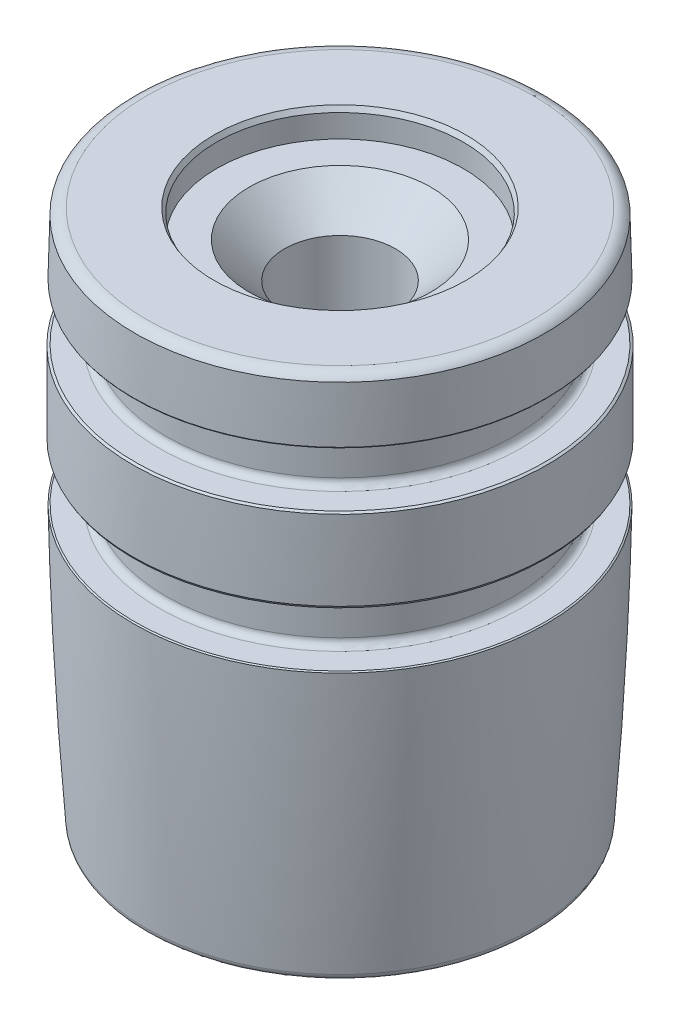
ISO-10303-21;
HEADER;
FILE_DESCRIPTION(('STEP AP214'),'2;1');
FILE_NAME('part.step','',(''),(''),'','','');
FILE_SCHEMA(('AUTOMOTIVE_DESIGN { 1 0 10303 214 1 1 1 1 }'));
ENDSEC;
DATA;
#1=APPLICATION_CONTEXT('core data for automotive mechanical design processes');
#2=APPLICATION_PROTOCOL_DEFINITION('international standard','automotive_design',2000,#1);
#3=PRODUCT_CONTEXT('',#1,'mechanical');
#4=PRODUCT('Part','Part','',(#3));
#5=PRODUCT_RELATED_PRODUCT_CATEGORY('part','',(#4));
#6=PRODUCT_DEFINITION_FORMATION('','',#4);
#7=PRODUCT_DEFINITION_CONTEXT('part definition',#1,'design');
#8=PRODUCT_DEFINITION('design','',#6,#7);
#9=PRODUCT_DEFINITION_SHAPE('','',#8);
#10=(LENGTH_UNIT() NAMED_UNIT(*) SI_UNIT(.MILLI.,.METRE.));
#11=(NAMED_UNIT(*) PLANE_ANGLE_UNIT() SI_UNIT($,.RADIAN.));
#12=(NAMED_UNIT(*) SI_UNIT($,.STERADIAN.) SOLID_ANGLE_UNIT());
#13=UNCERTAINTY_MEASURE_WITH_UNIT(LENGTH_MEASURE(1.E-05),#10,'distance_accuracy_value','');
#14=(GEOMETRIC_REPRESENTATION_CONTEXT(3) GLOBAL_UNCERTAINTY_ASSIGNED_CONTEXT((#13)) GLOBAL_UNIT_ASSIGNED_CONTEXT((#10,
#11,#12)) REPRESENTATION_CONTEXT('',''));
#15=CARTESIAN_POINT('',(0.,0.,0.));
#16=DIRECTION('',(0.,0.,1.));
#17=DIRECTION('',(1.,0.,0.));
#18=AXIS2_PLACEMENT_3D('',#15,#16,#17);
#19=CARTESIAN_POINT('',(0.,-0.999999999999999,0.));
#20=DIRECTION('',(0.,1.,0.));
#21=DIRECTION('',(-1.,0.,0.));
#22=AXIS2_PLACEMENT_3D('',#19,#20,#21);
#23=TOROIDAL_SURFACE('',#22,13.975,1.);
#24=CARTESIAN_POINT('',(0.,0.,0.));
#25=DIRECTION('',(0.,1.,0.));
#26=DIRECTION('',(-1.,0.,0.));
#27=AXIS2_PLACEMENT_3D('',#24,#25,#26);
#28=CIRCLE('',#27,13.975);
#29=CARTESIAN_POINT('',(-13.975,0.,0.));
#30=VERTEX_POINT('',#29);
#31=EDGE_CURVE('E109',#30,#30,#28,.T.);
#32=ORIENTED_EDGE('',*,*,#31,.F.);
#33=EDGE_LOOP('',(#32));
#34=FACE_BOUND('',#33,.T.);
#35=CARTESIAN_POINT('',(0.,-0.448553828580356,0.));
#36=DIRECTION('',(0.,1.,0.));
#37=DIRECTION('',(-1.,0.,0.));
#38=AXIS2_PLACEMENT_3D('',#35,#36,#37);
#39=CIRCLE('',#38,14.8092104724518);
#40=CARTESIAN_POINT('',(-14.8092104724518,-0.448553828580356,0.));
#41=VERTEX_POINT('',#40);
#42=EDGE_CURVE('E124',#41,#41,#39,.T.);
#43=ORIENTED_EDGE('',*,*,#42,.T.);
#44=EDGE_LOOP('',(#43));
#45=FACE_BOUND('',#44,.T.);
#46=ADVANCED_FACE('F37',(#34,#45),#23,.T.);
#47=CARTESIAN_POINT('',(0.,0.,0.));
#48=DIRECTION('',(0.,1.,0.));
#49=DIRECTION('',(-1.,0.,0.));
#50=AXIS2_PLACEMENT_3D('',#47,#48,#49);
#51=CYLINDRICAL_SURFACE('',#50,8.9);
#52=CARTESIAN_POINT('',(0.,-0.346410161513765,0.));
#53=DIRECTION('',(0.,1.,0.));
#54=DIRECTION('',(-1.,0.,0.));
#55=AXIS2_PLACEMENT_3D('',#52,#53,#54);
#56=CIRCLE('',#55,8.9);
#57=CARTESIAN_POINT('',(-8.9,-0.346410161513766,0.));
#58=VERTEX_POINT('',#57);
#59=EDGE_CURVE('E106',#58,#58,#56,.T.);
#60=ORIENTED_EDGE('',*,*,#59,.T.);
#61=EDGE_LOOP('',(#60));
#62=FACE_BOUND('',#61,.T.);
#63=CARTESIAN_POINT('',(0.,-2.,0.));
#64=DIRECTION('',(0.,1.,0.));
#65=DIRECTION('',(-1.,0.,0.));
#66=AXIS2_PLACEMENT_3D('',#63,#64,#65);
#67=CIRCLE('',#66,8.9);
#68=CARTESIAN_POINT('',(-8.9,-2.,0.));
#69=VERTEX_POINT('',#68);
#70=EDGE_CURVE('E121',#69,#69,#67,.T.);
#71=ORIENTED_EDGE('',*,*,#70,.F.);
#72=EDGE_LOOP('',(#71));
#73=FACE_BOUND('',#72,.T.);
#74=ADVANCED_FACE('F166',(#62,#73),#51,.F.);
#75=CARTESIAN_POINT('',(-8.9,0.,0.));
#76=DIRECTION('',(0.,1.,0.));
#77=DIRECTION('',(-1.,0.,0.));
#78=AXIS2_PLACEMENT_3D('',#75,#76,#77);
#79=PLANE('',#78);
#80=CARTESIAN_POINT('',(0.,0.,0.));
#81=DIRECTION('',(0.,1.,0.));
#82=DIRECTION('',(-1.,0.,0.));
#83=AXIS2_PLACEMENT_3D('',#80,#81,#82);
#84=CIRCLE('',#83,9.1);
#85=CARTESIAN_POINT('',(-9.1,0.,0.));
#86=VERTEX_POINT('',#85);
#87=EDGE_CURVE('E103',#86,#86,#84,.F.);
#88=ORIENTED_EDGE('',*,*,#87,.T.);
#89=EDGE_LOOP('',(#88));
#90=FACE_BOUND('',#89,.T.);
#91=ORIENTED_EDGE('',*,*,#31,.T.);
#92=EDGE_LOOP('',(#91));
#93=FACE_BOUND('',#92,.T.);
#94=ADVANCED_FACE('F172',(#90,#93),#79,.T.);
#95=CARTESIAN_POINT('',(-14.975,-38.5,0.));
#96=DIRECTION('',(0.,-1.,0.));
#97=DIRECTION('',(1.,0.,0.));
#98=AXIS2_PLACEMENT_3D('',#95,#96,#97);
#99=PLANE('',#98);
#100=CARTESIAN_POINT('',(0.,-38.5,0.));
#101=DIRECTION('',(0.,-1.,0.));
#102=DIRECTION('',(1.,0.,0.));
#103=AXIS2_PLACEMENT_3D('',#100,#101,#102);
#104=CIRCLE('',#103,13.5103719257929);
#105=CARTESIAN_POINT('',(13.5103719257929,-38.5,0.));
#106=VERTEX_POINT('',#105);
#107=EDGE_CURVE('E44',#106,#106,#104,.T.);
#108=ORIENTED_EDGE('',*,*,#107,.T.);
#109=EDGE_LOOP('',(#108));
#110=FACE_BOUND('',#109,.T.);
#111=CARTESIAN_POINT('',(0.,-38.5,0.));
#112=DIRECTION('',(0.,-1.,0.));
#113=DIRECTION('',(1.,0.,0.));
#114=AXIS2_PLACEMENT_3D('',#111,#112,#113);
#115=CIRCLE('',#114,10.2278203230275);
#116=CARTESIAN_POINT('',(10.2278203230275,-38.5,0.));
#117=VERTEX_POINT('',#116);
#118=EDGE_CURVE('E64',#117,#117,#115,.F.);
#119=ORIENTED_EDGE('',*,*,#118,.T.);
#120=EDGE_LOOP('',(#119));
#121=FACE_BOUND('',#120,.T.);
#122=ADVANCED_FACE('F237',(#110,#121),#99,.T.);
#123=CARTESIAN_POINT('',(0.,0.,0.));
#124=DIRECTION('',(0.,1.,0.));
#125=DIRECTION('',(-1.,0.,0.));
#126=AXIS2_PLACEMENT_3D('',#123,#124,#125);
#127=CYLINDRICAL_SURFACE('',#126,9.535);
#128=CARTESIAN_POINT('',(0.,-38.1,0.));
#129=DIRECTION('',(0.,-1.,0.));
#130=DIRECTION('',(1.,0.,0.));
#131=AXIS2_PLACEMENT_3D('',#128,#129,#130);
#132=CIRCLE('',#131,9.535);
#133=CARTESIAN_POINT('',(9.535,-38.1,0.));
#134=VERTEX_POINT('',#133);
#135=EDGE_CURVE('E61',#134,#134,#132,.T.);
#136=ORIENTED_EDGE('',*,*,#135,.T.);
#137=EDGE_LOOP('',(#136));
#138=FACE_BOUND('',#137,.T.);
#139=CARTESIAN_POINT('',(0.,-22.5,0.));
#140=DIRECTION('',(0.,1.,0.));
#141=DIRECTION('',(-1.,0.,0.));
#142=AXIS2_PLACEMENT_3D('',#139,#140,#141);
#143=CIRCLE('',#142,9.535);
#144=CARTESIAN_POINT('',(-9.53499999999999,-22.5,0.));
#145=VERTEX_POINT('',#144);
#146=EDGE_CURVE('E112',#145,#145,#143,.T.);
#147=ORIENTED_EDGE('',*,*,#146,.T.);
#148=EDGE_LOOP('',(#147));
#149=FACE_BOUND('',#148,.T.);
#150=ADVANCED_FACE('F233',(#138,#149),#127,.F.);
#151=CARTESIAN_POINT('',(-9.53499999999999,-22.5,0.));
#152=DIRECTION('',(0.,-1.,0.));
#153=DIRECTION('',(1.,0.,0.));
#154=AXIS2_PLACEMENT_3D('',#151,#152,#153);
#155=PLANE('',#154);
#156=CARTESIAN_POINT('',(0.,-22.5,0.));
#157=DIRECTION('',(0.,-1.,0.));
#158=DIRECTION('',(1.,0.,0.));
#159=AXIS2_PLACEMENT_3D('',#156,#157,#158);
#160=CIRCLE('',#159,4.69282032302752);
#161=CARTESIAN_POINT('',(4.69282032302753,-22.5,0.));
#162=VERTEX_POINT('',#161);
#163=EDGE_CURVE('E52',#162,#162,#160,.F.);
#164=ORIENTED_EDGE('',*,*,#163,.T.);
#165=EDGE_LOOP('',(#164));
#166=FACE_BOUND('',#165,.T.);
#167=ORIENTED_EDGE('',*,*,#146,.F.);
#168=EDGE_LOOP('',(#167));
#169=FACE_BOUND('',#168,.T.);
#170=ADVANCED_FACE('F229',(#166,#169),#155,.T.);
#171=CARTESIAN_POINT('',(0.,0.,0.));
#172=DIRECTION('',(0.,1.,0.));
#173=DIRECTION('',(-1.,0.,0.));
#174=AXIS2_PLACEMENT_3D('',#171,#172,#173);
#175=CYLINDRICAL_SURFACE('',#174,4.);
#176=CARTESIAN_POINT('',(0.,-22.1,0.));
#177=DIRECTION('',(0.,-1.,0.));
#178=DIRECTION('',(1.,0.,0.));
#179=AXIS2_PLACEMENT_3D('',#176,#177,#178);
#180=CIRCLE('',#179,4.);
#181=CARTESIAN_POINT('',(4.,-22.1,0.));
#182=VERTEX_POINT('',#181);
#183=EDGE_CURVE('E48',#182,#182,#180,.T.);
#184=ORIENTED_EDGE('',*,*,#183,.T.);
#185=EDGE_LOOP('',(#184));
#186=FACE_BOUND('',#185,.T.);
#187=CARTESIAN_POINT('',(0.,-4.56568542494925,0.));
#188=DIRECTION('',(0.,1.,0.));
#189=DIRECTION('',(-1.,0.,0.));
#190=AXIS2_PLACEMENT_3D('',#187,#188,#189);
#191=CIRCLE('',#190,4.);
#192=CARTESIAN_POINT('',(-4.,-4.56568542494925,0.));
#193=VERTEX_POINT('',#192);
#194=EDGE_CURVE('E115',#193,#193,#191,.T.);
#195=ORIENTED_EDGE('',*,*,#194,.T.);
#196=EDGE_LOOP('',(#195));
#197=FACE_BOUND('',#196,.T.);
#198=ADVANCED_FACE('F225',(#186,#197),#175,.F.);
#199=CARTESIAN_POINT('',(0.,-4.56568542494925,0.));
#200=DIRECTION('',(0.,1.,0.));
#201=DIRECTION('',(-1.,0.,0.));
#202=AXIS2_PLACEMENT_3D('',#199,#200,#201);
#203=CONICAL_SURFACE('',#202,4.,0.785398163397443);
#204=CARTESIAN_POINT('',(0.,-2.,0.));
#205=DIRECTION('',(0.,1.,0.));
#206=DIRECTION('',(-1.,0.,0.));
#207=AXIS2_PLACEMENT_3D('',#204,#205,#206);
#208=CIRCLE('',#207,6.56568542494922);
#209=CARTESIAN_POINT('',(-6.56568542494922,-2.,0.));
#210=VERTEX_POINT('',#209);
#211=EDGE_CURVE('E118',#210,#210,#208,.T.);
#212=ORIENTED_EDGE('',*,*,#211,.T.);
#213=EDGE_LOOP('',(#212));
#214=FACE_BOUND('',#213,.T.);
#215=ORIENTED_EDGE('',*,*,#194,.F.);
#216=EDGE_LOOP('',(#215));
#217=FACE_BOUND('',#216,.T.);
#218=ADVANCED_FACE('F221',(#214,#217),#203,.F.);
#219=CARTESIAN_POINT('',(-6.56568542494922,-2.,0.));
#220=DIRECTION('',(0.,1.,0.));
#221=DIRECTION('',(-1.,0.,0.));
#222=AXIS2_PLACEMENT_3D('',#219,#220,#221);
#223=PLANE('',#222);
#224=ORIENTED_EDGE('',*,*,#70,.T.);
#225=EDGE_LOOP('',(#224));
#226=FACE_BOUND('',#225,.T.);
#227=ORIENTED_EDGE('',*,*,#211,.F.);
#228=EDGE_LOOP('',(#227));
#229=FACE_BOUND('',#228,.T.);
#230=ADVANCED_FACE('F186',(#226,#229),#223,.T.);
#231=CARTESIAN_POINT('',(0.,-0.346410161513765,0.));
#232=DIRECTION('',(0.,1.,0.));
#233=DIRECTION('',(-1.,0.,0.));
#234=AXIS2_PLACEMENT_3D('',#231,#232,#233);
#235=CONICAL_SURFACE('',#234,8.9,0.523598775598316);
#236=ORIENTED_EDGE('',*,*,#87,.F.);
#237=EDGE_LOOP('',(#236));
#238=FACE_BOUND('',#237,.T.);
#239=ORIENTED_EDGE('',*,*,#59,.F.);
#240=EDGE_LOOP('',(#239));
#241=FACE_BOUND('',#240,.T.);
#242=ADVANCED_FACE('F180',(#238,#241),#235,.F.);
#243=CARTESIAN_POINT('',(0.,-38.5,0.));
#244=DIRECTION('',(0.,-1.,0.));
#245=DIRECTION('',(1.,0.,0.));
#246=AXIS2_PLACEMENT_3D('',#243,#244,#245);
#247=CONICAL_SURFACE('',#246,10.2278203230275,1.04719755119659);
#248=ORIENTED_EDGE('',*,*,#135,.F.);
#249=EDGE_LOOP('',(#248));
#250=FACE_BOUND('',#249,.T.);
#251=ORIENTED_EDGE('',*,*,#118,.F.);
#252=EDGE_LOOP('',(#251));
#253=FACE_BOUND('',#252,.T.);
#254=ADVANCED_FACE('F185',(#250,#253),#247,.F.);
#255=CARTESIAN_POINT('',(0.,-22.5,0.));
#256=DIRECTION('',(0.,-1.,0.));
#257=DIRECTION('',(1.,0.,0.));
#258=AXIS2_PLACEMENT_3D('',#255,#256,#257);
#259=CONICAL_SURFACE('',#258,4.69282032302753,1.0471975511966);
#260=CARTESIAN_POINT('',(4.,-22.1,0.));
#261=CARTESIAN_POINT('',(4.00721687836487,-22.1041666666667,0.));
#262=CARTESIAN_POINT('',(4.01443375672974,-22.1083333333333,0.));
#263=CARTESIAN_POINT('',(4.02886751345948,-22.1166666666667,0.));
#264=CARTESIAN_POINT('',(4.03608439182435,-22.1208333333333,0.));
#265=CARTESIAN_POINT('',(4.05051814855409,-22.1291666666667,0.));
#266=CARTESIAN_POINT('',(4.05773502691896,-22.1333333333333,0.));
#267=CARTESIAN_POINT('',(4.0721687836487,-22.1416666666667,0.));
#268=CARTESIAN_POINT('',(4.07938566201357,-22.1458333333333,0.));
#269=CARTESIAN_POINT('',(4.09381941874331,-22.1541666666667,0.));
#270=CARTESIAN_POINT('',(4.10103629710818,-22.1583333333333,0.));
#271=CARTESIAN_POINT('',(4.11547005383792,-22.1666666666667,0.));
#272=CARTESIAN_POINT('',(4.12268693220279,-22.1708333333333,0.));
#273=CARTESIAN_POINT('',(4.13712068893253,-22.1791666666667,0.));
#274=CARTESIAN_POINT('',(4.1443375672974,-22.1833333333333,0.));
#275=CARTESIAN_POINT('',(4.15877132402714,-22.1916666666667,0.));
#276=CARTESIAN_POINT('',(4.16598820239201,-22.1958333333333,0.));
#277=CARTESIAN_POINT('',(4.18042195912175,-22.2041666666667,0.));
#278=CARTESIAN_POINT('',(4.18763883748662,-22.2083333333333,0.));
#279=CARTESIAN_POINT('',(4.20207259421636,-22.2166666666667,0.));
#280=CARTESIAN_POINT('',(4.20928947258123,-22.2208333333333,0.));
#281=CARTESIAN_POINT('',(4.22372322931097,-22.2291666666667,0.));
#282=CARTESIAN_POINT('',(4.23094010767584,-22.2333333333333,0.));
#283=CARTESIAN_POINT('',(4.24537386440558,-22.2416666666667,0.));
#284=CARTESIAN_POINT('',(4.25259074277045,-22.2458333333333,0.));
#285=CARTESIAN_POINT('',(4.26702449950019,-22.2541666666667,0.));
#286=CARTESIAN_POINT('',(4.27424137786506,-22.2583333333333,0.));
#287=CARTESIAN_POINT('',(4.2886751345948,-22.2666666666667,0.));
#288=CARTESIAN_POINT('',(4.29589201295967,-22.2708333333333,0.));
#289=CARTESIAN_POINT('',(4.31032576968941,-22.2791666666667,0.));
#290=CARTESIAN_POINT('',(4.31754264805428,-22.2833333333333,0.));
#291=CARTESIAN_POINT('',(4.33197640478402,-22.2916666666667,0.));
#292=CARTESIAN_POINT('',(4.33919328314889,-22.2958333333333,0.));
#293=CARTESIAN_POINT('',(4.35362703987863,-22.3041666666667,0.));
#294=CARTESIAN_POINT('',(4.3608439182435,-22.3083333333333,0.));
#295=CARTESIAN_POINT('',(4.37527767497324,-22.3166666666667,0.));
#296=CARTESIAN_POINT('',(4.38249455333811,-22.3208333333333,0.));
#297=CARTESIAN_POINT('',(4.39692831006785,-22.3291666666667,0.));
#298=CARTESIAN_POINT('',(4.40414518843272,-22.3333333333333,0.));
#299=CARTESIAN_POINT('',(4.41857894516246,-22.3416666666667,0.));
#300=CARTESIAN_POINT('',(4.42579582352733,-22.3458333333333,0.));
#301=CARTESIAN_POINT('',(4.44022958025707,-22.3541666666667,0.));
#302=CARTESIAN_POINT('',(4.44744645862195,-22.3583333333333,0.));
#303=CARTESIAN_POINT('',(4.46188021535168,-22.3666666666667,0.));
#304=CARTESIAN_POINT('',(4.46909709371655,-22.3708333333333,0.));
#305=CARTESIAN_POINT('',(4.48353085044629,-22.3791666666667,0.));
#306=CARTESIAN_POINT('',(4.49074772881117,-22.3833333333333,0.));
#307=CARTESIAN_POINT('',(4.50518148554091,-22.3916666666667,0.));
#308=CARTESIAN_POINT('',(4.51239836390578,-22.3958333333333,0.));
#309=CARTESIAN_POINT('',(4.52683212063552,-22.4041666666667,0.));
#310=CARTESIAN_POINT('',(4.53404899900039,-22.4083333333333,0.));
#311=CARTESIAN_POINT('',(4.54848275573013,-22.4166666666667,0.));
#312=CARTESIAN_POINT('',(4.555699634095,-22.4208333333333,0.));
#313=CARTESIAN_POINT('',(4.57013339082474,-22.4291666666667,0.));
#314=CARTESIAN_POINT('',(4.57735026918961,-22.4333333333333,0.));
#315=CARTESIAN_POINT('',(4.59178402591935,-22.4416666666667,0.));
#316=CARTESIAN_POINT('',(4.59900090428422,-22.4458333333333,0.));
#317=CARTESIAN_POINT('',(4.61343466101396,-22.4541666666667,0.));
#318=CARTESIAN_POINT('',(4.62065153937883,-22.4583333333333,0.));
#319=CARTESIAN_POINT('',(4.63508529610857,-22.4666666666667,0.));
#320=CARTESIAN_POINT('',(4.64230217447344,-22.4708333333333,0.));
#321=CARTESIAN_POINT('',(4.65673593120318,-22.4791666666667,0.));
#322=CARTESIAN_POINT('',(4.66395280956805,-22.4833333333333,0.));
#323=CARTESIAN_POINT('',(4.67838656629779,-22.4916666666667,0.));
#324=CARTESIAN_POINT('',(4.68560344466266,-22.4958333333333,0.));
#325=CARTESIAN_POINT('',(4.69282032302753,-22.5,0.));
#326=B_SPLINE_CURVE_WITH_KNOTS('',3,(#260,#261,#262,#263,#264,#265,#266,#267,#268,#269,#270,
#271,#272,#273,#274,#275,#276,#277,#278,#279,#280,#281,#282,#283,#284,#285,#286,#287,#288,#289,
#290,#291,#292,#293,#294,#295,#296,#297,#298,#299,#300,#301,#302,#303,#304,#305,#306,#307,#308,
#309,#310,#311,#312,#313,#314,#315,#316,#317,#318,#319,#320,#321,#322,#323,#324,#325),
.UNSPECIFIED.,.F.,.F.,(4,2,2,2,2,2,2,2,2,2,2,2,2,2,2,2,2,2,2,2,2,2,2,2,2,2,2,2,2,2,2,2,4),(0.,
0.024999999999998,0.0499999999999969,0.0749999999999957,0.0999999999999962,0.124999999999995,
0.149999999999993,0.174999999999992,0.199999999999992,0.224999999999991,0.24999999999999,
0.274999999999991,0.299999999999989,0.324999999999987,0.349999999999986,0.374999999999987,
0.399999999999986,0.424999999999984,0.449999999999985,0.474999999999984,0.499999999999982,
0.524999999999981,0.549999999999981,0.57499999999998,0.599999999999979,0.624999999999979,
0.649999999999977,0.674999999999976,0.699999999999975,0.724999999999975,0.749999999999974,
0.774999999999973,0.799999999999973),.UNSPECIFIED.);
#327=EDGE_CURVE('BSEAM216',#182,#162,#326,.T.);
#328=ORIENTED_EDGE('',*,*,#183,.F.);
#329=ORIENTED_EDGE('',*,*,#163,.F.);
#330=ORIENTED_EDGE('',*,*,#327,.T.);
#331=ORIENTED_EDGE('',*,*,#327,.F.);
#332=EDGE_LOOP('',(#328,#330,#329,#331));
#333=FACE_BOUND('',#332,.T.);
#334=ADVANCED_FACE('F216',(#333),#259,.F.);
#335=CARTESIAN_POINT('',(0.,-11.4633974596216,0.));
#336=DIRECTION('',(0.,-1.,0.));
#337=DIRECTION('',(0.,0.,-1.));
#338=AXIS2_PLACEMENT_3D('',#335,#336,#337);
#339=DEGENERATE_TOROIDAL_SURFACE('',#338,351.013938463198,365.988938463198,.F.);
#340=ORIENTED_EDGE('',*,*,#42,.F.);
#341=EDGE_LOOP('',(#340));
#342=FACE_BOUND('',#341,.T.);
#343=CARTESIAN_POINT('',(0.,-4.44341534788306,0.));
#344=DIRECTION('',(0.,-1.,0.));
#345=DIRECTION('',(1.,0.,0.));
#346=AXIS2_PLACEMENT_3D('',#343,#344,#345);
#347=CIRCLE('',#346,14.9076691641317);
#348=CARTESIAN_POINT('',(14.9076691641317,-4.44341534788306,0.));
#349=VERTEX_POINT('',#348);
#350=EDGE_CURVE('E55',#349,#349,#347,.T.);
#351=ORIENTED_EDGE('',*,*,#350,.F.);
#352=EDGE_LOOP('',(#351));
#353=FACE_BOUND('',#352,.T.);
#354=ADVANCED_FACE('F145',(#342,#353),#339,.F.);
#355=CARTESIAN_POINT('',(0.,-38.0363028805358,0.));
#356=DIRECTION('',(0.,1.,0.));
#357=DIRECTION('',(-1.,0.,0.));
#358=AXIS2_PLACEMENT_3D('',#355,#356,#357);
#359=CIRCLE('',#358,14.0090522852064);
#360=CARTESIAN_POINT('',(-14.0090522852064,-38.0363028805358,0.));
#361=VERTEX_POINT('',#360);
#362=EDGE_CURVE('E10',#361,#361,#359,.T.);
#363=ORIENTED_EDGE('',*,*,#362,.T.);
#364=EDGE_LOOP('',(#363));
#365=FACE_BOUND('',#364,.T.);
#366=CARTESIAN_POINT('',(0.,-18.5602702086674,0.));
#367=DIRECTION('',(0.,1.,0.));
#368=DIRECTION('',(-1.,0.,0.));
#369=AXIS2_PLACEMENT_3D('',#366,#367,#368);
#370=CIRCLE('',#369,14.9061859828379);
#371=CARTESIAN_POINT('',(14.9061859828379,-18.5602702086674,0.));
#372=VERTEX_POINT('',#371);
#373=EDGE_CURVE('E127',#372,#372,#370,.T.);
#374=ORIENTED_EDGE('',*,*,#373,.F.);
#375=EDGE_LOOP('',(#374));
#376=FACE_BOUND('',#375,.T.);
#377=ADVANCED_FACE('F144',(#365,#376),#339,.F.);
#378=CARTESIAN_POINT('',(0.,-8.,0.));
#379=DIRECTION('',(0.,1.,0.));
#380=DIRECTION('',(-1.,0.,0.));
#381=AXIS2_PLACEMENT_3D('',#378,#379,#380);
#382=TOROIDAL_SURFACE('',#381,13.075,0.5);
#383=CARTESIAN_POINT('',(0.,-8.5,0.));
#384=DIRECTION('',(0.,1.,0.));
#385=DIRECTION('',(-1.,0.,0.));
#386=AXIS2_PLACEMENT_3D('',#383,#384,#385);
#387=CIRCLE('',#386,13.075);
#388=CARTESIAN_POINT('',(-13.075,-8.5,0.));
#389=VERTEX_POINT('',#388);
#390=EDGE_CURVE('E67',#389,#389,#387,.F.);
#391=ORIENTED_EDGE('',*,*,#390,.F.);
#392=EDGE_LOOP('',(#391));
#393=FACE_BOUND('',#392,.T.);
#394=CARTESIAN_POINT('',(0.,-8.,0.));
#395=DIRECTION('',(0.,1.,0.));
#396=DIRECTION('',(-1.,0.,0.));
#397=AXIS2_PLACEMENT_3D('',#394,#395,#396);
#398=CIRCLE('',#397,12.575);
#399=CARTESIAN_POINT('',(-12.575,-8.,0.));
#400=VERTEX_POINT('',#399);
#401=EDGE_CURVE('E73',#400,#400,#398,.T.);
#402=ORIENTED_EDGE('',*,*,#401,.F.);
#403=EDGE_LOOP('',(#402));
#404=FACE_BOUND('',#403,.T.);
#405=ADVANCED_FACE('F208',(#393,#404),#382,.F.);
#406=CARTESIAN_POINT('',(-12.575,-8.5,0.));
#407=DIRECTION('',(0.,1.,0.));
#408=DIRECTION('',(-1.,0.,0.));
#409=AXIS2_PLACEMENT_3D('',#406,#407,#408);
#410=PLANE('',#409);
#411=ORIENTED_EDGE('',*,*,#390,.T.);
#412=EDGE_LOOP('',(#411));
#413=FACE_BOUND('',#412,.T.);
#414=CARTESIAN_POINT('',(0.,-8.5,0.));
#415=DIRECTION('',(0.,1.,0.));
#416=DIRECTION('',(-1.,0.,0.));
#417=AXIS2_PLACEMENT_3D('',#414,#415,#416);
#418=CIRCLE('',#417,14.8017949192431);
#419=CARTESIAN_POINT('',(-14.8017949192431,-8.5,0.));
#420=VERTEX_POINT('',#419);
#421=EDGE_CURVE('E94',#420,#420,#418,.T.);
#422=ORIENTED_EDGE('',*,*,#421,.T.);
#423=EDGE_LOOP('',(#422));
#424=FACE_BOUND('',#423,.T.);
#425=ADVANCED_FACE('F213',(#413,#424),#410,.T.);
#426=CARTESIAN_POINT('',(0.,-8.5,0.));
#427=DIRECTION('',(0.,-1.,0.));
#428=DIRECTION('',(1.,0.,0.));
#429=AXIS2_PLACEMENT_3D('',#426,#427,#428);
#430=CONICAL_SURFACE('',#429,14.8017949192431,1.04719755119664);
#431=ORIENTED_EDGE('',*,*,#421,.F.);
#432=EDGE_LOOP('',(#431));
#433=FACE_BOUND('',#432,.T.);
#434=CARTESIAN_POINT('',(0.,-8.59350349472325,0.));
#435=DIRECTION('',(0.,1.,0.));
#436=DIRECTION('',(-1.,0.,0.));
#437=AXIS2_PLACEMENT_3D('',#434,#435,#436);
#438=CIRCLE('',#437,14.963747722789);
#439=CARTESIAN_POINT('',(-14.963747722789,-8.59350349472325,0.));
#440=VERTEX_POINT('',#439);
#441=EDGE_CURVE('E57',#440,#440,#438,.T.);
#442=ORIENTED_EDGE('',*,*,#441,.T.);
#443=EDGE_LOOP('',(#442));
#444=FACE_BOUND('',#443,.T.);
#445=ADVANCED_FACE('F136',(#433,#444),#430,.T.);
#446=CARTESIAN_POINT('',(0.,0.,0.));
#447=DIRECTION('',(0.,1.,0.));
#448=DIRECTION('',(-1.,0.,0.));
#449=AXIS2_PLACEMENT_3D('',#446,#447,#448);
#450=CYLINDRICAL_SURFACE('',#449,12.575);
#451=CARTESIAN_POINT('',(0.,-5.,0.));
#452=DIRECTION('',(0.,-1.,0.));
#453=DIRECTION('',(1.,0.,0.));
#454=AXIS2_PLACEMENT_3D('',#451,#452,#453);
#455=CIRCLE('',#454,12.575);
#456=CARTESIAN_POINT('',(12.575,-5.,0.));
#457=VERTEX_POINT('',#456);
#458=EDGE_CURVE('E70',#457,#457,#455,.T.);
#459=ORIENTED_EDGE('',*,*,#458,.T.);
#460=EDGE_LOOP('',(#459));
#461=FACE_BOUND('',#460,.T.);
#462=ORIENTED_EDGE('',*,*,#401,.T.);
#463=EDGE_LOOP('',(#462));
#464=FACE_BOUND('',#463,.T.);
#465=ADVANCED_FACE('F244',(#461,#464),#450,.T.);
#466=CARTESIAN_POINT('',(0.,-5.,0.));
#467=DIRECTION('',(0.,-1.,0.));
#468=DIRECTION('',(1.,0.,0.));
#469=AXIS2_PLACEMENT_3D('',#466,#467,#468);
#470=TOROIDAL_SURFACE('',#469,13.075,0.5);
#471=ORIENTED_EDGE('',*,*,#458,.F.);
#472=EDGE_LOOP('',(#471));
#473=FACE_BOUND('',#472,.T.);
#474=CARTESIAN_POINT('',(0.,-4.5,0.));
#475=DIRECTION('',(0.,-1.,0.));
#476=DIRECTION('',(1.,0.,0.));
#477=AXIS2_PLACEMENT_3D('',#474,#475,#476);
#478=CIRCLE('',#477,13.075);
#479=CARTESIAN_POINT('',(13.075,-4.5,0.));
#480=VERTEX_POINT('',#479);
#481=EDGE_CURVE('E76',#480,#480,#478,.F.);
#482=ORIENTED_EDGE('',*,*,#481,.F.);
#483=EDGE_LOOP('',(#482));
#484=FACE_BOUND('',#483,.T.);
#485=ADVANCED_FACE('F247',(#473,#484),#470,.F.);
#486=CARTESIAN_POINT('',(-14.975,-4.5,0.));
#487=DIRECTION('',(0.,-1.,0.));
#488=DIRECTION('',(1.,0.,0.));
#489=AXIS2_PLACEMENT_3D('',#486,#487,#488);
#490=PLANE('',#489);
#491=ORIENTED_EDGE('',*,*,#481,.T.);
#492=EDGE_LOOP('',(#491));
#493=FACE_BOUND('',#492,.T.);
#494=CARTESIAN_POINT('',(0.,-4.5,0.));
#495=DIRECTION('',(0.,-1.,0.));
#496=DIRECTION('',(1.,0.,0.));
#497=AXIS2_PLACEMENT_3D('',#494,#495,#496);
#498=CIRCLE('',#497,14.875);
#499=CARTESIAN_POINT('',(14.875,-4.5,0.));
#500=VERTEX_POINT('',#499);
#501=EDGE_CURVE('E91',#500,#500,#498,.T.);
#502=ORIENTED_EDGE('',*,*,#501,.T.);
#503=EDGE_LOOP('',(#502));
#504=FACE_BOUND('',#503,.T.);
#505=ADVANCED_FACE('F249',(#493,#504),#490,.T.);
#506=CARTESIAN_POINT('',(0.,-4.3267949192431,0.));
#507=DIRECTION('',(0.,1.,0.));
#508=DIRECTION('',(-1.,0.,0.));
#509=AXIS2_PLACEMENT_3D('',#506,#507,#508);
#510=CONICAL_SURFACE('',#509,14.975,0.523598775598288);
#511=ORIENTED_EDGE('',*,*,#501,.F.);
#512=EDGE_LOOP('',(#511));
#513=FACE_BOUND('',#512,.T.);
#514=ORIENTED_EDGE('',*,*,#350,.T.);
#515=EDGE_LOOP('',(#514));
#516=FACE_BOUND('',#515,.T.);
#517=ADVANCED_FACE('F142',(#513,#516),#510,.T.);
#518=ORIENTED_EDGE('',*,*,#441,.F.);
#519=EDGE_LOOP('',(#518));
#520=FACE_BOUND('',#519,.T.);
#521=CARTESIAN_POINT('',(0.,-14.3464637556387,0.));
#522=DIRECTION('',(0.,-1.,0.));
#523=DIRECTION('',(1.,0.,0.));
#524=AXIS2_PLACEMENT_3D('',#521,#522,#523);
#525=CIRCLE('',#524,14.9636441920124);
#526=CARTESIAN_POINT('',(14.9636441920124,-14.3464637556387,0.));
#527=VERTEX_POINT('',#526);
#528=EDGE_CURVE('E130',#527,#527,#525,.T.);
#529=ORIENTED_EDGE('',*,*,#528,.F.);
#530=EDGE_LOOP('',(#529));
#531=FACE_BOUND('',#530,.T.);
#532=ADVANCED_FACE('F138',(#520,#531),#339,.F.);
#533=CARTESIAN_POINT('',(0.,-18.,0.));
#534=DIRECTION('',(0.,1.,0.));
#535=DIRECTION('',(-1.,0.,0.));
#536=AXIS2_PLACEMENT_3D('',#533,#534,#535);
#537=TOROIDAL_SURFACE('',#536,13.075,0.5);
#538=CARTESIAN_POINT('',(0.,-18.5,0.));
#539=DIRECTION('',(0.,1.,0.));
#540=DIRECTION('',(-1.,0.,0.));
#541=AXIS2_PLACEMENT_3D('',#538,#539,#540);
#542=CIRCLE('',#541,13.075);
#543=CARTESIAN_POINT('',(-13.075,-18.5,0.));
#544=VERTEX_POINT('',#543);
#545=EDGE_CURVE('E79',#544,#544,#542,.F.);
#546=ORIENTED_EDGE('',*,*,#545,.F.);
#547=EDGE_LOOP('',(#546));
#548=FACE_BOUND('',#547,.T.);
#549=CARTESIAN_POINT('',(0.,-18.,0.));
#550=DIRECTION('',(0.,1.,0.));
#551=DIRECTION('',(-1.,0.,0.));
#552=AXIS2_PLACEMENT_3D('',#549,#550,#551);
#553=CIRCLE('',#552,12.575);
#554=CARTESIAN_POINT('',(-12.575,-18.,0.));
#555=VERTEX_POINT('',#554);
#556=EDGE_CURVE('E85',#555,#555,#553,.T.);
#557=ORIENTED_EDGE('',*,*,#556,.F.);
#558=EDGE_LOOP('',(#557));
#559=FACE_BOUND('',#558,.T.);
#560=ADVANCED_FACE('F141',(#548,#559),#537,.F.);
#561=CARTESIAN_POINT('',(-12.575,-18.5,0.));
#562=DIRECTION('',(0.,1.,0.));
#563=DIRECTION('',(-1.,0.,0.));
#564=AXIS2_PLACEMENT_3D('',#561,#562,#563);
#565=PLANE('',#564);
#566=ORIENTED_EDGE('',*,*,#545,.T.);
#567=EDGE_LOOP('',(#566));
#568=FACE_BOUND('',#567,.T.);
#569=CARTESIAN_POINT('',(0.,-18.5,0.));
#570=DIRECTION('',(0.,1.,0.));
#571=DIRECTION('',(-1.,0.,0.));
#572=AXIS2_PLACEMENT_3D('',#569,#570,#571);
#573=CIRCLE('',#572,14.8017949192431);
#574=CARTESIAN_POINT('',(14.8017949192431,-18.5,0.));
#575=VERTEX_POINT('',#574);
#576=EDGE_CURVE('E100',#575,#575,#573,.T.);
#577=ORIENTED_EDGE('',*,*,#576,.T.);
#578=EDGE_LOOP('',(#577));
#579=FACE_BOUND('',#578,.T.);
#580=ADVANCED_FACE('F193',(#568,#579),#565,.T.);
#581=CARTESIAN_POINT('',(0.,-18.5,0.));
#582=DIRECTION('',(0.,-1.,0.));
#583=DIRECTION('',(1.,0.,0.));
#584=AXIS2_PLACEMENT_3D('',#581,#582,#583);
#585=CONICAL_SURFACE('',#584,14.8017949192431,1.04719755119663);
#586=CARTESIAN_POINT('',(14.8017949192431,-18.5,0.));
#587=CARTESIAN_POINT('',(14.8028823261556,-18.5006278146736,0.));
#588=CARTESIAN_POINT('',(14.803969733068,-18.5012556293472,0.));
#589=CARTESIAN_POINT('',(14.8061445468929,-18.5025112586945,0.));
#590=CARTESIAN_POINT('',(14.8072319538053,-18.5031390733681,0.));
#591=CARTESIAN_POINT('',(14.8094067676302,-18.5043947027153,0.));
#592=CARTESIAN_POINT('',(14.8104941745427,-18.505022517389,0.));
#593=CARTESIAN_POINT('',(14.8126689883676,-18.5062781467362,0.));
#594=CARTESIAN_POINT('',(14.81375639528,-18.5069059614098,0.));
#595=CARTESIAN_POINT('',(14.8159312091049,-18.508161590757,0.));
#596=CARTESIAN_POINT('',(14.8170186160174,-18.5087894054307,0.));
#597=CARTESIAN_POINT('',(14.8191934298423,-18.5100450347779,0.));
#598=CARTESIAN_POINT('',(14.8202808367547,-18.5106728494515,0.));
#599=CARTESIAN_POINT('',(14.8224556505796,-18.5119284787988,0.));
#600=CARTESIAN_POINT('',(14.823543057492,-18.5125562934724,0.));
#601=CARTESIAN_POINT('',(14.8257178713169,-18.5138119228196,0.));
#602=CARTESIAN_POINT('',(14.8268052782294,-18.5144397374932,0.));
#603=CARTESIAN_POINT('',(14.8289800920543,-18.5156953668405,0.));
#604=CARTESIAN_POINT('',(14.8300674989667,-18.5163231815141,0.));
#605=CARTESIAN_POINT('',(14.8322423127916,-18.5175788108613,0.));
#606=CARTESIAN_POINT('',(14.833329719704,-18.518206625535,0.));
#607=CARTESIAN_POINT('',(14.8355045335289,-18.5194622548822,0.));
#608=CARTESIAN_POINT('',(14.8365919404414,-18.5200900695558,0.));
#609=CARTESIAN_POINT('',(14.8387667542663,-18.5213456989031,0.));
#610=CARTESIAN_POINT('',(14.8398541611787,-18.5219735135767,0.));
#611=CARTESIAN_POINT('',(14.8420289750036,-18.5232291429239,0.));
#612=CARTESIAN_POINT('',(14.8431163819161,-18.5238569575975,0.));
#613=CARTESIAN_POINT('',(14.845291195741,-18.5251125869448,0.));
#614=CARTESIAN_POINT('',(14.8463786026534,-18.5257404016184,0.));
#615=CARTESIAN_POINT('',(14.8485534164783,-18.5269960309656,0.));
#616=CARTESIAN_POINT('',(14.8496408233907,-18.5276238456392,0.));
#617=CARTESIAN_POINT('',(14.8518156372156,-18.5288794749865,0.));
#618=CARTESIAN_POINT('',(14.8529030441281,-18.5295072896601,0.));
#619=CARTESIAN_POINT('',(14.855077857953,-18.5307629190073,0.));
#620=CARTESIAN_POINT('',(14.8561652648654,-18.531390733681,0.));
#621=CARTESIAN_POINT('',(14.8583400786903,-18.5326463630282,0.));
#622=CARTESIAN_POINT('',(14.8594274856027,-18.5332741777018,0.));
#623=CARTESIAN_POINT('',(14.8616022994276,-18.5345298070491,0.));
#624=CARTESIAN_POINT('',(14.8626897063401,-18.5351576217227,0.));
#625=CARTESIAN_POINT('',(14.864864520165,-18.5364132510699,0.));
#626=CARTESIAN_POINT('',(14.8659519270774,-18.5370410657435,0.));
#627=CARTESIAN_POINT('',(14.8681267409023,-18.5382966950908,0.));
#628=CARTESIAN_POINT('',(14.8692141478148,-18.5389245097644,0.));
#629=CARTESIAN_POINT('',(14.8713889616396,-18.5401801391116,0.));
#630=CARTESIAN_POINT('',(14.8724763685521,-18.5408079537852,0.));
#631=CARTESIAN_POINT('',(14.874651182377,-18.5420635831325,0.));
#632=CARTESIAN_POINT('',(14.8757385892894,-18.5426913978061,0.));
#633=CARTESIAN_POINT('',(14.8779134031143,-18.5439470271533,0.));
#634=CARTESIAN_POINT('',(14.8790008100268,-18.544574841827,0.));
#635=CARTESIAN_POINT('',(14.8811756238517,-18.5458304711742,0.));
#636=CARTESIAN_POINT('',(14.8822630307641,-18.5464582858478,0.));
#637=CARTESIAN_POINT('',(14.884437844589,-18.5477139151951,0.));
#638=CARTESIAN_POINT('',(14.8855252515014,-18.5483417298687,0.));
#639=CARTESIAN_POINT('',(14.8877000653263,-18.5495973592159,0.));
#640=CARTESIAN_POINT('',(14.8887874722388,-18.5502251738895,0.));
#641=CARTESIAN_POINT('',(14.8909622860637,-18.5514808032368,0.));
#642=CARTESIAN_POINT('',(14.8920496929761,-18.5521086179104,0.));
#643=CARTESIAN_POINT('',(14.894224506801,-18.5533642472576,0.));
#644=CARTESIAN_POINT('',(14.8953119137135,-18.5539920619312,0.));
#645=CARTESIAN_POINT('',(14.8974867275383,-18.5552476912785,0.));
#646=CARTESIAN_POINT('',(14.8985741344508,-18.5558755059521,0.));
#647=CARTESIAN_POINT('',(14.9007489482757,-18.5571311352993,0.));
#648=CARTESIAN_POINT('',(14.9018363551881,-18.557758949973,0.));
#649=CARTESIAN_POINT('',(14.904011169013,-18.5590145793202,0.));
#650=CARTESIAN_POINT('',(14.9050985759255,-18.5596423939938,0.));
#651=CARTESIAN_POINT('',(14.9061859828379,-18.5602702086674,0.));
#652=B_SPLINE_CURVE_WITH_KNOTS('',3,(#586,#587,#588,#589,#590,#591,#592,#593,#594,#595,#596,
#597,#598,#599,#600,#601,#602,#603,#604,#605,#606,#607,#608,#609,#610,#611,#612,#613,#614,#615,
#616,#617,#618,#619,#620,#621,#622,#623,#624,#625,#626,#627,#628,#629,#630,#631,#632,#633,#634,
#635,#636,#637,#638,#639,#640,#641,#642,#643,#644,#645,#646,#647,#648,#649,#650,#651),
.UNSPECIFIED.,.F.,.F.,(4,2,2,2,2,2,2,2,2,2,2,2,2,2,2,2,2,2,2,2,2,2,2,2,2,2,2,2,2,2,2,2,4),(0.,
0.00376688804171404,0.00753377608342808,0.0113006641251439,0.0150675521668594,
0.0188344402085752,0.0226013282502892,0.026368216292005,0.0301351043337205,0.0339019923754346,
0.0376688804171504,0.0414357684588644,0.0452026565005817,0.0489695445422957,0.0527364325840115,
0.0565033206257255,0.0602702086674396,0.0640370967091568,0.0678039847508709,0.0715708727925867,
0.0753377608343007,0.079104648876018,0.082871536917732,0.0866384249594478,0.0904053130011618,
0.0941722010428773,0.0979390890845931,0.101705977126307,0.105472865168023,0.109239753209738,
0.113006641251454,0.116773529293168,0.120540417334882),.UNSPECIFIED.);
#653=EDGE_CURVE('BSEAM188',#575,#372,#652,.T.);
#654=ORIENTED_EDGE('',*,*,#576,.F.);
#655=ORIENTED_EDGE('',*,*,#373,.T.);
#656=ORIENTED_EDGE('',*,*,#653,.T.);
#657=ORIENTED_EDGE('',*,*,#653,.F.);
#658=EDGE_LOOP('',(#654,#656,#655,#657));
#659=FACE_BOUND('',#658,.T.);
#660=ADVANCED_FACE('F188',(#659),#585,.T.);
#661=CARTESIAN_POINT('',(0.,0.,0.));
#662=DIRECTION('',(0.,1.,0.));
#663=DIRECTION('',(-1.,0.,0.));
#664=AXIS2_PLACEMENT_3D('',#661,#662,#663);
#665=CYLINDRICAL_SURFACE('',#664,12.575);
#666=CARTESIAN_POINT('',(0.,-15.,0.));
#667=DIRECTION('',(0.,-1.,0.));
#668=DIRECTION('',(1.,0.,0.));
#669=AXIS2_PLACEMENT_3D('',#666,#667,#668);
#670=CIRCLE('',#669,12.575);
#671=CARTESIAN_POINT('',(12.575,-15.,0.));
#672=VERTEX_POINT('',#671);
#673=EDGE_CURVE('E82',#672,#672,#670,.T.);
#674=ORIENTED_EDGE('',*,*,#673,.T.);
#675=EDGE_LOOP('',(#674));
#676=FACE_BOUND('',#675,.T.);
#677=ORIENTED_EDGE('',*,*,#556,.T.);
#678=EDGE_LOOP('',(#677));
#679=FACE_BOUND('',#678,.T.);
#680=ADVANCED_FACE('F192',(#676,#679),#665,.T.);
#681=CARTESIAN_POINT('',(0.,-15.,0.));
#682=DIRECTION('',(0.,-1.,0.));
#683=DIRECTION('',(1.,0.,0.));
#684=AXIS2_PLACEMENT_3D('',#681,#682,#683);
#685=TOROIDAL_SURFACE('',#684,13.075,0.5);
#686=ORIENTED_EDGE('',*,*,#673,.F.);
#687=EDGE_LOOP('',(#686));
#688=FACE_BOUND('',#687,.T.);
#689=CARTESIAN_POINT('',(0.,-14.5,0.));
#690=DIRECTION('',(0.,-1.,0.));
#691=DIRECTION('',(1.,0.,0.));
#692=AXIS2_PLACEMENT_3D('',#689,#690,#691);
#693=CIRCLE('',#692,13.075);
#694=CARTESIAN_POINT('',(13.075,-14.5,0.));
#695=VERTEX_POINT('',#694);
#696=EDGE_CURVE('E88',#695,#695,#693,.F.);
#697=ORIENTED_EDGE('',*,*,#696,.F.);
#698=EDGE_LOOP('',(#697));
#699=FACE_BOUND('',#698,.T.);
#700=ADVANCED_FACE('F158',(#688,#699),#685,.F.);
#701=CARTESIAN_POINT('',(-14.975,-14.5,0.));
#702=DIRECTION('',(0.,-1.,0.));
#703=DIRECTION('',(1.,0.,0.));
#704=AXIS2_PLACEMENT_3D('',#701,#702,#703);
#705=PLANE('',#704);
#706=ORIENTED_EDGE('',*,*,#696,.T.);
#707=EDGE_LOOP('',(#706));
#708=FACE_BOUND('',#707,.T.);
#709=CARTESIAN_POINT('',(0.,-14.5,0.));
#710=DIRECTION('',(0.,-1.,0.));
#711=DIRECTION('',(1.,0.,0.));
#712=AXIS2_PLACEMENT_3D('',#709,#710,#711);
#713=CIRCLE('',#712,14.875);
#714=CARTESIAN_POINT('',(14.875,-14.5,0.));
#715=VERTEX_POINT('',#714);
#716=EDGE_CURVE('E97',#715,#715,#713,.T.);
#717=ORIENTED_EDGE('',*,*,#716,.T.);
#718=EDGE_LOOP('',(#717));
#719=FACE_BOUND('',#718,.T.);
#720=ADVANCED_FACE('F150',(#708,#719),#705,.T.);
#721=CARTESIAN_POINT('',(0.,-14.3267949192431,0.));
#722=DIRECTION('',(0.,1.,0.));
#723=DIRECTION('',(-1.,0.,0.));
#724=AXIS2_PLACEMENT_3D('',#721,#722,#723);
#725=CONICAL_SURFACE('',#724,14.975,0.523598775598287);
#726=ORIENTED_EDGE('',*,*,#716,.F.);
#727=EDGE_LOOP('',(#726));
#728=FACE_BOUND('',#727,.T.);
#729=ORIENTED_EDGE('',*,*,#528,.T.);
#730=EDGE_LOOP('',(#729));
#731=FACE_BOUND('',#730,.T.);
#732=ADVANCED_FACE('F148',(#728,#731),#725,.T.);
#733=CARTESIAN_POINT('',(0.,-38.,0.));
#734=DIRECTION('',(0.,-1.,0.));
#735=DIRECTION('',(1.,0.,0.));
#736=AXIS2_PLACEMENT_3D('',#733,#734,#735);
#737=TOROIDAL_SURFACE('',#736,13.5103719257929,0.5);
#738=ORIENTED_EDGE('',*,*,#362,.F.);
#739=EDGE_LOOP('',(#738));
#740=FACE_BOUND('',#739,.T.);
#741=ORIENTED_EDGE('',*,*,#107,.F.);
#742=EDGE_LOOP('',(#741));
#743=FACE_BOUND('',#742,.T.);
#744=ADVANCED_FACE('F39',(#740,#743),#737,.T.);
#745=CLOSED_SHELL('',(#46,#74,#94,#122,#150,#170,#198,#218,#230,#242,#254,#334,#354,#377,#405,
#425,#445,#465,#485,#505,#517,#532,#560,#580,#660,#680,#700,#720,#732,#744));
#746=MANIFOLD_SOLID_BREP('B2',#745);
#747=ADVANCED_BREP_SHAPE_REPRESENTATION('',(#18,#746),#14);
#748=SHAPE_DEFINITION_REPRESENTATION(#9,#747);
ENDSEC;
END-ISO-10303-21;
